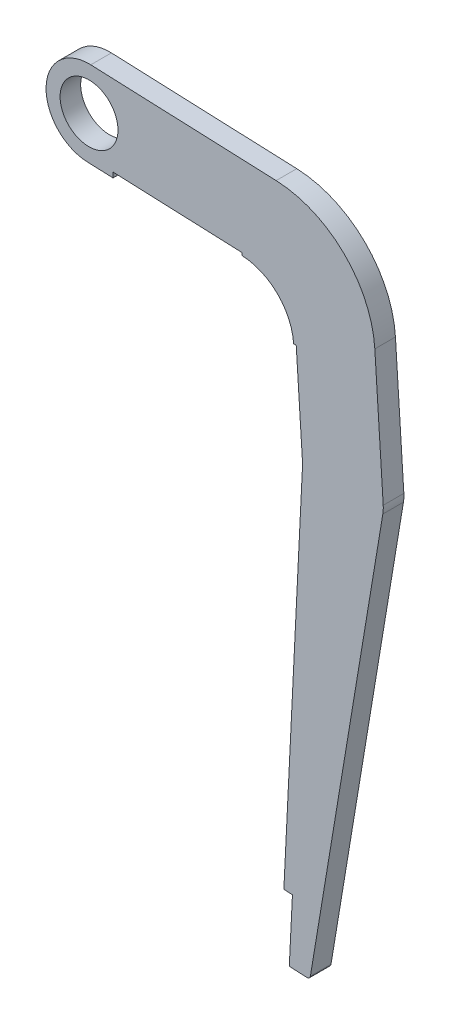
ISO-10303-21;
HEADER;
FILE_DESCRIPTION(('STEP AP214'),'2;1');
FILE_NAME('part.step','',(''),(''),'','','');
FILE_SCHEMA(('AUTOMOTIVE_DESIGN { 1 0 10303 214 1 1 1 1 }'));
ENDSEC;
DATA;
#1=APPLICATION_CONTEXT('core data for automotive mechanical design processes');
#2=APPLICATION_PROTOCOL_DEFINITION('international standard','automotive_design',2000,#1);
#3=PRODUCT_CONTEXT('',#1,'mechanical');
#4=PRODUCT('Part','Part','',(#3));
#5=PRODUCT_RELATED_PRODUCT_CATEGORY('part','',(#4));
#6=PRODUCT_DEFINITION_FORMATION('','',#4);
#7=PRODUCT_DEFINITION_CONTEXT('part definition',#1,'design');
#8=PRODUCT_DEFINITION('design','',#6,#7);
#9=PRODUCT_DEFINITION_SHAPE('','',#8);
#10=(LENGTH_UNIT() NAMED_UNIT(*) SI_UNIT(.MILLI.,.METRE.));
#11=(NAMED_UNIT(*) PLANE_ANGLE_UNIT() SI_UNIT($,.RADIAN.));
#12=(NAMED_UNIT(*) SI_UNIT($,.STERADIAN.) SOLID_ANGLE_UNIT());
#13=UNCERTAINTY_MEASURE_WITH_UNIT(LENGTH_MEASURE(1.E-05),#10,'distance_accuracy_value','');
#14=(GEOMETRIC_REPRESENTATION_CONTEXT(3) GLOBAL_UNCERTAINTY_ASSIGNED_CONTEXT((#13)) GLOBAL_UNIT_ASSIGNED_CONTEXT((#10,
#11,#12)) REPRESENTATION_CONTEXT('',''));
#15=CARTESIAN_POINT('',(0.,0.,0.));
#16=DIRECTION('',(0.,0.,1.));
#17=DIRECTION('',(1.,0.,0.));
#18=AXIS2_PLACEMENT_3D('',#15,#16,#17);
#19=CARTESIAN_POINT('',(-1.02010487388112,-24.9791790506871,0.));
#20=DIRECTION('',(-0.0408041949552447,-0.999167162027483,0.));
#21=DIRECTION('',(0.999167162027483,-0.0408041949552447,0.));
#22=AXIS2_PLACEMENT_3D('',#19,#20,#21);
#23=PLANE('',#22);
#24=DIRECTION('',(0.,0.,-1.));
#25=VECTOR('',#24,1.);
#26=CARTESIAN_POINT('',(13.9552913226989,-25.5907473739468,0.));
#27=LINE('',#26,#25);
#28=CARTESIAN_POINT('',(13.9552913226989,-25.5907473739468,12.));
#29=VERTEX_POINT('',#28);
#30=CARTESIAN_POINT('',(13.9552913226989,-25.5907473739468,0.));
#31=VERTEX_POINT('',#30);
#32=EDGE_CURVE('E11',#29,#31,#27,.T.);
#33=ORIENTED_EDGE('',*,*,#32,.F.);
#34=DIRECTION('',(0.999167162027483,-0.0408041949552447,0.));
#35=VECTOR('',#34,1.);
#36=CARTESIAN_POINT('',(-1.02010487388112,-24.9791790506871,12.));
#37=LINE('',#36,#35);
#38=CARTESIAN_POINT('',(-1.02010487388112,-24.9791790506871,12.));
#39=VERTEX_POINT('',#38);
#40=EDGE_CURVE('E260',#39,#29,#37,.T.);
#41=ORIENTED_EDGE('',*,*,#40,.F.);
#42=DIRECTION('',(0.,0.,-1.));
#43=VECTOR('',#42,1.);
#44=CARTESIAN_POINT('',(-1.02010487388112,-24.9791790506871,0.));
#45=LINE('',#44,#43);
#46=CARTESIAN_POINT('',(-1.02010487388112,-24.9791790506871,0.));
#47=VERTEX_POINT('',#46);
#48=EDGE_CURVE('E57',#39,#47,#45,.T.);
#49=ORIENTED_EDGE('',*,*,#48,.T.);
#50=DIRECTION('',(0.999167162027483,-0.0408041949552447,0.));
#51=VECTOR('',#50,1.);
#52=CARTESIAN_POINT('',(-1.02010487388112,-24.9791790506871,0.));
#53=LINE('',#52,#51);
#54=EDGE_CURVE('E306',#47,#31,#53,.T.);
#55=ORIENTED_EDGE('',*,*,#54,.T.);
#56=EDGE_LOOP('',(#33,#41,#49,#55));
#57=FACE_BOUND('',#56,.T.);
#58=ADVANCED_FACE('F46',(#57),#23,.T.);
#59=CARTESIAN_POINT('',(0.,0.,0.));
#60=DIRECTION('',(0.,0.,1.));
#61=DIRECTION('',(1.,0.,0.));
#62=AXIS2_PLACEMENT_3D('',#59,#60,#61);
#63=CYLINDRICAL_SURFACE('',#62,25.);
#64=ORIENTED_EDGE('',*,*,#48,.F.);
#65=CARTESIAN_POINT('',(0.,0.,12.));
#66=DIRECTION('',(0.,0.,1.));
#67=DIRECTION('',(1.,0.,0.));
#68=AXIS2_PLACEMENT_3D('',#65,#66,#67);
#69=CIRCLE('',#68,25.);
#70=CARTESIAN_POINT('',(1.02010487388112,24.9791790506871,12.));
#71=VERTEX_POINT('',#70);
#72=EDGE_CURVE('E256',#71,#39,#69,.T.);
#73=ORIENTED_EDGE('',*,*,#72,.F.);
#74=DIRECTION('',(0.,0.,-1.));
#75=VECTOR('',#74,1.);
#76=CARTESIAN_POINT('',(1.02010487388112,24.9791790506871,0.));
#77=LINE('',#76,#75);
#78=CARTESIAN_POINT('',(1.02010487388112,24.9791790506871,0.));
#79=VERTEX_POINT('',#78);
#80=EDGE_CURVE('E300',#71,#79,#77,.T.);
#81=ORIENTED_EDGE('',*,*,#80,.T.);
#82=CARTESIAN_POINT('',(0.,0.,0.));
#83=DIRECTION('',(0.,0.,1.));
#84=DIRECTION('',(1.,0.,0.));
#85=AXIS2_PLACEMENT_3D('',#82,#83,#84);
#86=CIRCLE('',#85,25.);
#87=EDGE_CURVE('E313',#79,#47,#86,.T.);
#88=ORIENTED_EDGE('',*,*,#87,.T.);
#89=EDGE_LOOP('',(#64,#73,#81,#88));
#90=FACE_BOUND('',#89,.T.);
#91=ADVANCED_FACE('F318',(#90),#63,.T.);
#92=CARTESIAN_POINT('',(1.02010487388112,24.9791790506871,0.));
#93=DIRECTION('',(0.0408041949552447,0.999167162027483,0.));
#94=DIRECTION('',(-0.999167162027483,0.0408041949552447,0.));
#95=AXIS2_PLACEMENT_3D('',#92,#93,#94);
#96=PLANE('',#95);
#97=ORIENTED_EDGE('',*,*,#80,.F.);
#98=DIRECTION('',(-0.999167162027483,0.0408041949552447,0.));
#99=VECTOR('',#98,1.);
#100=CARTESIAN_POINT('',(1.02010487388112,24.9791790506871,12.));
#101=LINE('',#100,#99);
#102=CARTESIAN_POINT('',(108.926121294905,20.5724908625436,12.));
#103=VERTEX_POINT('',#102);
#104=EDGE_CURVE('E252',#103,#71,#101,.T.);
#105=ORIENTED_EDGE('',*,*,#104,.F.);
#106=DIRECTION('',(0.,0.,-1.));
#107=VECTOR('',#106,1.);
#108=CARTESIAN_POINT('',(108.926121294905,20.5724908625436,0.));
#109=LINE('',#108,#107);
#110=CARTESIAN_POINT('',(108.926121294905,20.5724908625436,0.));
#111=VERTEX_POINT('',#110);
#112=EDGE_CURVE('E297',#103,#111,#109,.T.);
#113=ORIENTED_EDGE('',*,*,#112,.T.);
#114=DIRECTION('',(-0.999167162027483,0.0408041949552447,0.));
#115=VECTOR('',#114,1.);
#116=CARTESIAN_POINT('',(1.02010487388112,24.9791790506871,0.));
#117=LINE('',#116,#115);
#118=EDGE_CURVE('E320',#111,#79,#117,.T.);
#119=ORIENTED_EDGE('',*,*,#118,.T.);
#120=EDGE_LOOP('',(#97,#105,#113,#119));
#121=FACE_BOUND('',#120,.T.);
#122=ADVANCED_FACE('F457',(#121),#96,.T.);
#123=CARTESIAN_POINT('',(106.477869597591,-39.3775388591053,0.));
#124=DIRECTION('',(0.,0.,1.));
#125=DIRECTION('',(1.,0.,0.));
#126=AXIS2_PLACEMENT_3D('',#123,#124,#125);
#127=CYLINDRICAL_SURFACE('',#126,60.);
#128=ORIENTED_EDGE('',*,*,#112,.F.);
#129=CARTESIAN_POINT('',(106.477869597591,-39.3775388591053,12.));
#130=DIRECTION('',(0.,0.,1.));
#131=DIRECTION('',(1.,0.,0.));
#132=AXIS2_PLACEMENT_3D('',#129,#130,#131);
#133=CIRCLE('',#132,60.);
#134=CARTESIAN_POINT('',(166.355398771362,-35.5458942978034,12.));
#135=VERTEX_POINT('',#134);
#136=EDGE_CURVE('E248',#103,#135,#133,.F.);
#137=ORIENTED_EDGE('',*,*,#136,.T.);
#138=DIRECTION('',(0.,0.,-1.));
#139=VECTOR('',#138,1.);
#140=CARTESIAN_POINT('',(166.355398771362,-35.5458942978034,0.));
#141=LINE('',#140,#139);
#142=CARTESIAN_POINT('',(166.355398771362,-35.5458942978034,0.));
#143=VERTEX_POINT('',#142);
#144=EDGE_CURVE('E294',#135,#143,#141,.T.);
#145=ORIENTED_EDGE('',*,*,#144,.T.);
#146=CARTESIAN_POINT('',(106.477869597591,-39.3775388591053,0.));
#147=DIRECTION('',(0.,0.,1.));
#148=DIRECTION('',(1.,0.,0.));
#149=AXIS2_PLACEMENT_3D('',#146,#147,#148);
#150=CIRCLE('',#149,60.);
#151=EDGE_CURVE('E324',#111,#143,#150,.F.);
#152=ORIENTED_EDGE('',*,*,#151,.F.);
#153=EDGE_LOOP('',(#128,#137,#145,#152));
#154=FACE_BOUND('',#153,.T.);
#155=ADVANCED_FACE('F501',(#154),#127,.T.);
#156=CARTESIAN_POINT('',(162.905370512054,18.3680751328224,0.));
#157=DIRECTION('',(0.997958819562857,0.0638607426883654,0.));
#158=DIRECTION('',(-0.0638607426883654,0.997958819562857,0.));
#159=AXIS2_PLACEMENT_3D('',#156,#157,#158);
#160=PLANE('',#159);
#161=ORIENTED_EDGE('',*,*,#144,.F.);
#162=DIRECTION('',(-0.0638607426883654,0.997958819562857,0.));
#163=VECTOR('',#162,1.);
#164=CARTESIAN_POINT('',(162.905370512054,18.3680751328224,12.));
#165=LINE('',#164,#163);
#166=CARTESIAN_POINT('',(171.243379865616,-111.930910154438,12.));
#167=VERTEX_POINT('',#166);
#168=EDGE_CURVE('E244',#167,#135,#165,.T.);
#169=ORIENTED_EDGE('',*,*,#168,.F.);
#170=DIRECTION('',(0.,0.,-1.));
#171=VECTOR('',#170,1.);
#172=CARTESIAN_POINT('',(171.243379865616,-111.930910154438,0.));
#173=LINE('',#172,#171);
#174=CARTESIAN_POINT('',(171.243379865616,-111.930910154438,0.));
#175=VERTEX_POINT('',#174);
#176=EDGE_CURVE('E291',#167,#175,#173,.T.);
#177=ORIENTED_EDGE('',*,*,#176,.T.);
#178=DIRECTION('',(-0.0638607426883654,0.997958819562857,0.));
#179=VECTOR('',#178,1.);
#180=CARTESIAN_POINT('',(162.905370512054,18.3680751328224,0.));
#181=LINE('',#180,#179);
#182=EDGE_CURVE('E331',#175,#143,#181,.T.);
#183=ORIENTED_EDGE('',*,*,#182,.T.);
#184=EDGE_LOOP('',(#161,#169,#177,#183));
#185=FACE_BOUND('',#184,.T.);
#186=ADVANCED_FACE('F497',(#185),#160,.T.);
#187=CARTESIAN_POINT('',(151.284203474359,-113.208125008206,0.));
#188=DIRECTION('',(0.,0.,1.));
#189=DIRECTION('',(1.,0.,0.));
#190=AXIS2_PLACEMENT_3D('',#187,#188,#189);
#191=CYLINDRICAL_SURFACE('',#190,20.);
#192=ORIENTED_EDGE('',*,*,#176,.F.);
#193=CARTESIAN_POINT('',(151.284203474359,-113.208125008206,12.));
#194=DIRECTION('',(0.,0.,1.));
#195=DIRECTION('',(1.,0.,0.));
#196=AXIS2_PLACEMENT_3D('',#193,#194,#195);
#197=CIRCLE('',#196,20.);
#198=CARTESIAN_POINT('',(171.014245871716,-116.483094778827,12.));
#199=VERTEX_POINT('',#198);
#200=EDGE_CURVE('E240',#167,#199,#197,.F.);
#201=ORIENTED_EDGE('',*,*,#200,.T.);
#202=DIRECTION('',(0.,0.,-1.));
#203=VECTOR('',#202,1.);
#204=CARTESIAN_POINT('',(171.014245871716,-116.483094778827,0.));
#205=LINE('',#204,#203);
#206=CARTESIAN_POINT('',(171.014245871716,-116.483094778827,0.));
#207=VERTEX_POINT('',#206);
#208=EDGE_CURVE('E288',#199,#207,#205,.T.);
#209=ORIENTED_EDGE('',*,*,#208,.T.);
#210=CARTESIAN_POINT('',(151.284203474359,-113.208125008206,0.));
#211=DIRECTION('',(0.,0.,1.));
#212=DIRECTION('',(1.,0.,0.));
#213=AXIS2_PLACEMENT_3D('',#210,#211,#212);
#214=CIRCLE('',#213,20.);
#215=EDGE_CURVE('E335',#175,#207,#214,.F.);
#216=ORIENTED_EDGE('',*,*,#215,.F.);
#217=EDGE_LOOP('',(#192,#201,#209,#216));
#218=FACE_BOUND('',#217,.T.);
#219=ADVANCED_FACE('F493',(#218),#191,.T.);
#220=CARTESIAN_POINT('',(171.389870978236,-114.220142814009,0.));
#221=DIRECTION('',(0.986502119867865,-0.163748488531066,0.));
#222=DIRECTION('',(0.163748488531066,0.986502119867865,0.));
#223=AXIS2_PLACEMENT_3D('',#220,#221,#222);
#224=PLANE('',#223);
#225=ORIENTED_EDGE('',*,*,#208,.F.);
#226=DIRECTION('',(0.163748488531066,0.986502119867865,0.));
#227=VECTOR('',#226,1.);
#228=CARTESIAN_POINT('',(171.389870978236,-114.220142814009,12.));
#229=LINE('',#228,#227);
#230=CARTESIAN_POINT('',(128.850807395398,-370.496562694989,12.));
#231=VERTEX_POINT('',#230);
#232=EDGE_CURVE('E236',#231,#199,#229,.T.);
#233=ORIENTED_EDGE('',*,*,#232,.F.);
#234=DIRECTION('',(0.,0.,-1.));
#235=VECTOR('',#234,1.);
#236=CARTESIAN_POINT('',(128.850807395398,-370.496562694989,0.));
#237=LINE('',#236,#235);
#238=CARTESIAN_POINT('',(128.850807395398,-370.496562694989,0.));
#239=VERTEX_POINT('',#238);
#240=EDGE_CURVE('E285',#231,#239,#237,.T.);
#241=ORIENTED_EDGE('',*,*,#240,.T.);
#242=DIRECTION('',(0.163748488531066,0.986502119867865,0.));
#243=VECTOR('',#242,1.);
#244=CARTESIAN_POINT('',(171.389870978236,-114.220142814009,0.));
#245=LINE('',#244,#243);
#246=EDGE_CURVE('E339',#239,#207,#245,.T.);
#247=ORIENTED_EDGE('',*,*,#246,.T.);
#248=EDGE_LOOP('',(#225,#233,#241,#247));
#249=FACE_BOUND('',#248,.T.);
#250=ADVANCED_FACE('F489',(#249),#224,.T.);
#251=CARTESIAN_POINT('',(126.877803155662,-370.169065717927,0.));
#252=DIRECTION('',(0.,0.,1.));
#253=DIRECTION('',(1.,0.,0.));
#254=AXIS2_PLACEMENT_3D('',#251,#252,#253);
#255=CYLINDRICAL_SURFACE('',#254,2.);
#256=ORIENTED_EDGE('',*,*,#240,.F.);
#257=CARTESIAN_POINT('',(126.877803155662,-370.169065717927,12.));
#258=DIRECTION('',(0.,0.,1.));
#259=DIRECTION('',(1.,0.,0.));
#260=AXIS2_PLACEMENT_3D('',#257,#258,#259);
#261=CIRCLE('',#260,2.);
#262=CARTESIAN_POINT('',(126.778759337733,-372.166611793023,12.));
#263=VERTEX_POINT('',#262);
#264=EDGE_CURVE('E232',#231,#263,#261,.F.);
#265=ORIENTED_EDGE('',*,*,#264,.T.);
#266=DIRECTION('',(0.,0.,-1.));
#267=VECTOR('',#266,1.);
#268=CARTESIAN_POINT('',(126.778759337733,-372.166611793023,0.));
#269=LINE('',#268,#267);
#270=CARTESIAN_POINT('',(126.778759337733,-372.166611793023,0.));
#271=VERTEX_POINT('',#270);
#272=EDGE_CURVE('E282',#263,#271,#269,.T.);
#273=ORIENTED_EDGE('',*,*,#272,.T.);
#274=CARTESIAN_POINT('',(126.877803155662,-370.169065717927,0.));
#275=DIRECTION('',(0.,0.,1.));
#276=DIRECTION('',(1.,0.,0.));
#277=AXIS2_PLACEMENT_3D('',#274,#275,#276);
#278=CIRCLE('',#277,2.);
#279=EDGE_CURVE('E343',#239,#271,#278,.F.);
#280=ORIENTED_EDGE('',*,*,#279,.F.);
#281=EDGE_LOOP('',(#256,#265,#273,#280));
#282=FACE_BOUND('',#281,.T.);
#283=ADVANCED_FACE('F485',(#282),#255,.T.);
#284=CARTESIAN_POINT('',(128.558946358854,-372.254878352377,0.));
#285=DIRECTION('',(-0.0495219089647808,-0.998773037547813,0.));
#286=DIRECTION('',(0.998773037547812,-0.0495219089647808,0.));
#287=AXIS2_PLACEMENT_3D('',#284,#285,#286);
#288=PLANE('',#287);
#289=ORIENTED_EDGE('',*,*,#272,.F.);
#290=DIRECTION('',(0.998773037547812,-0.0495219089647808,0.));
#291=VECTOR('',#290,1.);
#292=CARTESIAN_POINT('',(128.558946358854,-372.254878352377,12.));
#293=LINE('',#292,#291);
#294=CARTESIAN_POINT('',(116.57366990828,-371.6606154448,12.));
#295=VERTEX_POINT('',#294);
#296=EDGE_CURVE('E228',#295,#263,#293,.T.);
#297=ORIENTED_EDGE('',*,*,#296,.F.);
#298=DIRECTION('',(0.,0.,-1.));
#299=VECTOR('',#298,1.);
#300=CARTESIAN_POINT('',(116.57366990828,-371.6606154448,0.));
#301=LINE('',#300,#299);
#302=CARTESIAN_POINT('',(116.57366990828,-371.6606154448,0.));
#303=VERTEX_POINT('',#302);
#304=EDGE_CURVE('E279',#295,#303,#301,.T.);
#305=ORIENTED_EDGE('',*,*,#304,.T.);
#306=DIRECTION('',(0.998773037547812,-0.0495219089647808,0.));
#307=VECTOR('',#306,1.);
#308=CARTESIAN_POINT('',(128.558946358854,-372.254878352377,0.));
#309=LINE('',#308,#307);
#310=EDGE_CURVE('E347',#303,#271,#309,.T.);
#311=ORIENTED_EDGE('',*,*,#310,.T.);
#312=EDGE_LOOP('',(#289,#297,#305,#311));
#313=FACE_BOUND('',#312,.T.);
#314=ADVANCED_FACE('F482',(#313),#288,.T.);
#315=CARTESIAN_POINT('',(134.670542869666,-6.67733520380468,0.));
#316=DIRECTION('',(0.998773037547813,-0.0495219089647786,0.));
#317=DIRECTION('',(0.0495219089647786,0.998773037547813,0.));
#318=AXIS2_PLACEMENT_3D('',#315,#316,#317);
#319=PLANE('',#318);
#320=ORIENTED_EDGE('',*,*,#304,.F.);
#321=DIRECTION('',(0.0495219089647786,0.998773037547813,0.));
#322=VECTOR('',#321,1.);
#323=CARTESIAN_POINT('',(134.670542869666,-6.67733520380468,12.));
#324=LINE('',#323,#322);
#325=CARTESIAN_POINT('',(118.405980539977,-334.70601305553,12.));
#326=VERTEX_POINT('',#325);
#327=EDGE_CURVE('E224',#295,#326,#324,.T.);
#328=ORIENTED_EDGE('',*,*,#327,.T.);
#329=DIRECTION('',(0.,0.,-1.));
#330=VECTOR('',#329,1.);
#331=CARTESIAN_POINT('',(118.405980539977,-334.70601305553,0.));
#332=LINE('',#331,#330);
#333=CARTESIAN_POINT('',(118.405980539977,-334.70601305553,0.));
#334=VERTEX_POINT('',#333);
#335=EDGE_CURVE('E276',#326,#334,#332,.T.);
#336=ORIENTED_EDGE('',*,*,#335,.T.);
#337=DIRECTION('',(0.0495219089647786,0.998773037547813,0.));
#338=VECTOR('',#337,1.);
#339=CARTESIAN_POINT('',(134.670542869666,-6.67733520380468,0.));
#340=LINE('',#339,#338);
#341=EDGE_CURVE('E351',#303,#334,#340,.T.);
#342=ORIENTED_EDGE('',*,*,#341,.F.);
#343=EDGE_LOOP('',(#320,#328,#336,#342));
#344=FACE_BOUND('',#343,.T.);
#345=ADVANCED_FACE('F479',(#344),#319,.F.);
#346=CARTESIAN_POINT('',(-16.2645623296886,-328.028677851726,0.));
#347=DIRECTION('',(0.0495219089647753,0.998773037547813,0.));
#348=DIRECTION('',(-0.998773037547813,0.0495219089647753,0.));
#349=AXIS2_PLACEMENT_3D('',#346,#347,#348);
#350=PLANE('',#349);
#351=ORIENTED_EDGE('',*,*,#335,.F.);
#352=DIRECTION('',(-0.998773037547813,0.0495219089647753,0.));
#353=VECTOR('',#352,1.);
#354=CARTESIAN_POINT('',(-16.2645623296886,-328.028677851726,12.));
#355=LINE('',#354,#353);
#356=CARTESIAN_POINT('',(113.412115352239,-334.458403510707,12.));
#357=VERTEX_POINT('',#356);
#358=EDGE_CURVE('E220',#326,#357,#355,.T.);
#359=ORIENTED_EDGE('',*,*,#358,.T.);
#360=DIRECTION('',(0.,0.,-1.));
#361=VECTOR('',#360,1.);
#362=CARTESIAN_POINT('',(113.412115352239,-334.458403510707,0.));
#363=LINE('',#362,#361);
#364=CARTESIAN_POINT('',(113.412115352239,-334.458403510707,0.));
#365=VERTEX_POINT('',#364);
#366=EDGE_CURVE('E185',#357,#365,#363,.T.);
#367=ORIENTED_EDGE('',*,*,#366,.T.);
#368=DIRECTION('',(-0.998773037547813,0.0495219089647753,0.));
#369=VECTOR('',#368,1.);
#370=CARTESIAN_POINT('',(-16.2645623296886,-328.028677851726,0.));
#371=LINE('',#370,#369);
#372=EDGE_CURVE('E194',#334,#365,#371,.T.);
#373=ORIENTED_EDGE('',*,*,#372,.F.);
#374=EDGE_LOOP('',(#351,#359,#367,#373));
#375=FACE_BOUND('',#374,.T.);
#376=ADVANCED_FACE('F368',(#375),#350,.F.);
#377=CARTESIAN_POINT('',(124.315371497829,-114.558191920736,0.));
#378=DIRECTION('',(0.998773037547813,-0.0495219089647782,0.));
#379=DIRECTION('',(0.0495219089647782,0.998773037547813,0.));
#380=AXIS2_PLACEMENT_3D('',#377,#378,#379);
#381=PLANE('',#380);
#382=ORIENTED_EDGE('',*,*,#366,.F.);
#383=DIRECTION('',(0.0495219089647782,0.998773037547813,0.));
#384=VECTOR('',#383,1.);
#385=CARTESIAN_POINT('',(124.315371497829,-114.558191920736,12.));
#386=LINE('',#385,#384);
#387=CARTESIAN_POINT('',(124.315371497829,-114.558191920736,12.));
#388=VERTEX_POINT('',#387);
#389=EDGE_CURVE('E180',#357,#388,#386,.T.);
#390=ORIENTED_EDGE('',*,*,#389,.T.);
#391=DIRECTION('',(0.,0.,-1.));
#392=VECTOR('',#391,1.);
#393=CARTESIAN_POINT('',(124.315371497829,-114.558191920736,0.));
#394=LINE('',#393,#392);
#395=CARTESIAN_POINT('',(124.315371497829,-114.558191920736,0.));
#396=VERTEX_POINT('',#395);
#397=EDGE_CURVE('E175',#388,#396,#394,.T.);
#398=ORIENTED_EDGE('',*,*,#397,.T.);
#399=DIRECTION('',(0.0495219089647782,0.998773037547813,0.));
#400=VECTOR('',#399,1.);
#401=CARTESIAN_POINT('',(124.315371497829,-114.558191920736,0.));
#402=LINE('',#401,#400);
#403=EDGE_CURVE('E178',#365,#396,#402,.T.);
#404=ORIENTED_EDGE('',*,*,#403,.F.);
#405=EDGE_LOOP('',(#382,#390,#398,#404));
#406=FACE_BOUND('',#405,.T.);
#407=ADVANCED_FACE('F177',(#406),#381,.F.);
#408=CARTESIAN_POINT('',(120.601343671677,-56.5186723476985,0.));
#409=DIRECTION('',(0.997958819562857,0.0638607426883653,0.));
#410=DIRECTION('',(-0.0638607426883653,0.997958819562857,0.));
#411=AXIS2_PLACEMENT_3D('',#408,#409,#410);
#412=PLANE('',#411);
#413=ORIENTED_EDGE('',*,*,#397,.F.);
#414=DIRECTION('',(-0.0638607426883653,0.997958819562857,0.));
#415=VECTOR('',#414,1.);
#416=CARTESIAN_POINT('',(120.601343671677,-56.5186723476985,12.));
#417=LINE('',#416,#415);
#418=CARTESIAN_POINT('',(120.601343671677,-56.5186723476985,12.));
#419=VERTEX_POINT('',#418);
#420=EDGE_CURVE('E214',#388,#419,#417,.T.);
#421=ORIENTED_EDGE('',*,*,#420,.T.);
#422=DIRECTION('',(0.,0.,-1.));
#423=VECTOR('',#422,1.);
#424=CARTESIAN_POINT('',(120.601343671677,-56.5186723476985,0.));
#425=LINE('',#424,#423);
#426=CARTESIAN_POINT('',(120.601343671677,-56.5186723476985,0.));
#427=VERTEX_POINT('',#426);
#428=EDGE_CURVE('E186',#419,#427,#425,.T.);
#429=ORIENTED_EDGE('',*,*,#428,.T.);
#430=DIRECTION('',(-0.0638607426883653,0.997958819562857,0.));
#431=VECTOR('',#430,1.);
#432=CARTESIAN_POINT('',(120.601343671677,-56.5186723476985,0.));
#433=LINE('',#432,#431);
#434=EDGE_CURVE('E191',#396,#427,#433,.T.);
#435=ORIENTED_EDGE('',*,*,#434,.F.);
#436=EDGE_LOOP('',(#413,#421,#429,#435));
#437=FACE_BOUND('',#436,.T.);
#438=ADVANCED_FACE('F197',(#437),#412,.F.);
#439=CARTESIAN_POINT('',(13.9552913226989,-22.5882467774375,0.));
#440=DIRECTION('',(0.0408041949552447,0.999167162027483,0.));
#441=DIRECTION('',(-0.999167162027483,0.0408041949552447,0.));
#442=AXIS2_PLACEMENT_3D('',#439,#440,#441);
#443=PLANE('',#442);
#444=DIRECTION('',(0.,0.,-1.));
#445=VECTOR('',#444,1.);
#446=CARTESIAN_POINT('',(89.0152410596258,-25.6535605095077,0.));
#447=LINE('',#446,#445);
#448=CARTESIAN_POINT('',(89.0152410596258,-25.6535605095077,12.));
#449=VERTEX_POINT('',#448);
#450=CARTESIAN_POINT('',(89.0152410596258,-25.6535605095077,0.));
#451=VERTEX_POINT('',#450);
#452=EDGE_CURVE('E268',#449,#451,#447,.T.);
#453=ORIENTED_EDGE('',*,*,#452,.F.);
#454=DIRECTION('',(-0.999167162027483,0.0408041949552447,0.));
#455=VECTOR('',#454,1.);
#456=CARTESIAN_POINT('',(13.9552913226989,-22.5882467774375,12.));
#457=LINE('',#456,#455);
#458=CARTESIAN_POINT('',(13.9552913226989,-22.5882467774375,12.));
#459=VERTEX_POINT('',#458);
#460=EDGE_CURVE('E208',#449,#459,#457,.T.);
#461=ORIENTED_EDGE('',*,*,#460,.T.);
#462=DIRECTION('',(0.,0.,-1.));
#463=VECTOR('',#462,1.);
#464=CARTESIAN_POINT('',(13.9552913226989,-22.5882467774375,0.));
#465=LINE('',#464,#463);
#466=CARTESIAN_POINT('',(13.9552913226989,-22.5882467774375,0.));
#467=VERTEX_POINT('',#466);
#468=EDGE_CURVE('E50',#459,#467,#465,.T.);
#469=ORIENTED_EDGE('',*,*,#468,.T.);
#470=DIRECTION('',(-0.999167162027483,0.0408041949552447,0.));
#471=VECTOR('',#470,1.);
#472=CARTESIAN_POINT('',(13.9552913226989,-22.5882467774375,0.));
#473=LINE('',#472,#471);
#474=EDGE_CURVE('E65',#451,#467,#473,.T.);
#475=ORIENTED_EDGE('',*,*,#474,.F.);
#476=EDGE_LOOP('',(#453,#461,#469,#475));
#477=FACE_BOUND('',#476,.T.);
#478=ADVANCED_FACE('F433',(#477),#443,.F.);
#479=CARTESIAN_POINT('',(13.9552913226989,-22.5882467774375,0.));
#480=DIRECTION('',(-1.,0.,0.));
#481=DIRECTION('',(0.,-1.,0.));
#482=AXIS2_PLACEMENT_3D('',#479,#480,#481);
#483=PLANE('',#482);
#484=DIRECTION('',(0.,1.,0.));
#485=VECTOR('',#484,1.);
#486=CARTESIAN_POINT('',(13.9552913226989,0.,12.));
#487=LINE('',#486,#485);
#488=EDGE_CURVE('E212',#459,#29,#487,.F.);
#489=ORIENTED_EDGE('',*,*,#488,.T.);
#490=ORIENTED_EDGE('',*,*,#32,.T.);
#491=DIRECTION('',(0.,-1.,0.));
#492=VECTOR('',#491,1.);
#493=CARTESIAN_POINT('',(13.9552913226989,-22.5882467774375,0.));
#494=LINE('',#493,#492);
#495=EDGE_CURVE('E315',#467,#31,#494,.T.);
#496=ORIENTED_EDGE('',*,*,#495,.F.);
#497=ORIENTED_EDGE('',*,*,#468,.F.);
#498=EDGE_LOOP('',(#489,#490,#496,#497));
#499=FACE_BOUND('',#498,.T.);
#500=ADVANCED_FACE('F431',(#499),#483,.F.);
#501=CARTESIAN_POINT('',(0.,0.,0.));
#502=DIRECTION('',(0.,0.,1.));
#503=DIRECTION('',(1.,0.,0.));
#504=AXIS2_PLACEMENT_3D('',#501,#502,#503);
#505=CYLINDRICAL_SURFACE('',#504,16.85);
#506=CARTESIAN_POINT('',(0.,0.,0.));
#507=DIRECTION('',(0.,0.,1.));
#508=DIRECTION('',(1.,0.,0.));
#509=AXIS2_PLACEMENT_3D('',#506,#507,#508);
#510=CIRCLE('',#509,16.85);
#511=CARTESIAN_POINT('',(16.85,0.,0.));
#512=VERTEX_POINT('',#511);
#513=EDGE_CURVE('E200',#512,#512,#510,.T.);
#514=ORIENTED_EDGE('',*,*,#513,.F.);
#515=EDGE_LOOP('',(#514));
#516=FACE_BOUND('',#515,.T.);
#517=CARTESIAN_POINT('',(0.,0.,12.));
#518=DIRECTION('',(0.,0.,1.));
#519=DIRECTION('',(1.,0.,0.));
#520=AXIS2_PLACEMENT_3D('',#517,#518,#519);
#521=CIRCLE('',#520,16.85);
#522=CARTESIAN_POINT('',(16.85,0.,12.));
#523=VERTEX_POINT('',#522);
#524=EDGE_CURVE('E217',#523,#523,#521,.T.);
#525=ORIENTED_EDGE('',*,*,#524,.T.);
#526=EDGE_LOOP('',(#525));
#527=FACE_BOUND('',#526,.T.);
#528=ADVANCED_FACE('F48',(#516,#527),#505,.F.);
#529=CARTESIAN_POINT('',(0.,0.,0.));
#530=DIRECTION('',(0.,0.,1.));
#531=DIRECTION('',(1.,0.,0.));
#532=AXIS2_PLACEMENT_3D('',#529,#530,#531);
#533=PLANE('',#532);
#534=ORIENTED_EDGE('',*,*,#474,.T.);
#535=ORIENTED_EDGE('',*,*,#495,.T.);
#536=ORIENTED_EDGE('',*,*,#54,.F.);
#537=ORIENTED_EDGE('',*,*,#87,.F.);
#538=ORIENTED_EDGE('',*,*,#118,.F.);
#539=ORIENTED_EDGE('',*,*,#151,.T.);
#540=ORIENTED_EDGE('',*,*,#182,.F.);
#541=ORIENTED_EDGE('',*,*,#215,.T.);
#542=ORIENTED_EDGE('',*,*,#246,.F.);
#543=ORIENTED_EDGE('',*,*,#279,.T.);
#544=ORIENTED_EDGE('',*,*,#310,.F.);
#545=ORIENTED_EDGE('',*,*,#341,.T.);
#546=ORIENTED_EDGE('',*,*,#372,.T.);
#547=ORIENTED_EDGE('',*,*,#403,.T.);
#548=ORIENTED_EDGE('',*,*,#434,.T.);
#549=DIRECTION('',(-0.997958819562857,-0.0638607426883681,0.));
#550=VECTOR('',#549,1.);
#551=CARTESIAN_POINT('',(120.601343671677,-56.5186723476985,0.));
#552=LINE('',#551,#550);
#553=CARTESIAN_POINT('',(119.104405442333,-56.6144634617311,0.));
#554=VERTEX_POINT('',#553);
#555=EDGE_CURVE('E130',#427,#554,#552,.T.);
#556=ORIENTED_EDGE('',*,*,#555,.T.);
#557=CARTESIAN_POINT('',(87.6687026261028,-58.6260768564146,0.));
#558=DIRECTION('',(0.,0.,1.));
#559=DIRECTION('',(1.,0.,0.));
#560=AXIS2_PLACEMENT_3D('',#557,#558,#559);
#561=CIRCLE('',#560,31.5);
#562=CARTESIAN_POINT('',(88.9540347671929,-27.1523112525489,0.));
#563=VERTEX_POINT('',#562);
#564=EDGE_CURVE('E385',#554,#563,#561,.T.);
#565=ORIENTED_EDGE('',*,*,#564,.T.);
#566=DIRECTION('',(0.0408041949552425,0.999167162027483,0.));
#567=VECTOR('',#566,1.);
#568=CARTESIAN_POINT('',(89.0152410596258,-25.6535605095077,0.));
#569=LINE('',#568,#567);
#570=EDGE_CURVE('E213',#563,#451,#569,.T.);
#571=ORIENTED_EDGE('',*,*,#570,.T.);
#572=EDGE_LOOP('',(#534,#535,#536,#537,#538,#539,#540,#541,#542,#543,#544,#545,#546,#547,#548,
#556,#565,#571));
#573=FACE_BOUND('',#572,.T.);
#574=ORIENTED_EDGE('',*,*,#513,.T.);
#575=EDGE_LOOP('',(#574));
#576=FACE_BOUND('',#575,.T.);
#577=ADVANCED_FACE('F189',(#573,#576),#533,.F.);
#578=CARTESIAN_POINT('',(0.,0.,12.));
#579=DIRECTION('',(0.,0.,1.));
#580=DIRECTION('',(1.,0.,0.));
#581=AXIS2_PLACEMENT_3D('',#578,#579,#580);
#582=PLANE('',#581);
#583=ORIENTED_EDGE('',*,*,#460,.F.);
#584=DIRECTION('',(-0.0408041949552425,-0.999167162027483,0.));
#585=VECTOR('',#584,1.);
#586=CARTESIAN_POINT('',(89.0152410596258,-25.6535605095077,12.));
#587=LINE('',#586,#585);
#588=CARTESIAN_POINT('',(88.9540347671929,-27.1523112525489,12.));
#589=VERTEX_POINT('',#588);
#590=EDGE_CURVE('E393',#449,#589,#587,.T.);
#591=ORIENTED_EDGE('',*,*,#590,.T.);
#592=CARTESIAN_POINT('',(87.6687026261028,-58.6260768564146,12.));
#593=DIRECTION('',(0.,0.,-1.));
#594=DIRECTION('',(1.,0.,0.));
#595=AXIS2_PLACEMENT_3D('',#592,#593,#594);
#596=CIRCLE('',#595,31.5);
#597=CARTESIAN_POINT('',(119.104405442333,-56.6144634617311,12.));
#598=VERTEX_POINT('',#597);
#599=EDGE_CURVE('E397',#589,#598,#596,.T.);
#600=ORIENTED_EDGE('',*,*,#599,.T.);
#601=DIRECTION('',(0.997958819562857,0.0638607426883681,0.));
#602=VECTOR('',#601,1.);
#603=CARTESIAN_POINT('',(120.601343671677,-56.5186723476985,12.));
#604=LINE('',#603,#602);
#605=EDGE_CURVE('E378',#598,#419,#604,.T.);
#606=ORIENTED_EDGE('',*,*,#605,.T.);
#607=ORIENTED_EDGE('',*,*,#420,.F.);
#608=ORIENTED_EDGE('',*,*,#389,.F.);
#609=ORIENTED_EDGE('',*,*,#358,.F.);
#610=ORIENTED_EDGE('',*,*,#327,.F.);
#611=ORIENTED_EDGE('',*,*,#296,.T.);
#612=ORIENTED_EDGE('',*,*,#264,.F.);
#613=ORIENTED_EDGE('',*,*,#232,.T.);
#614=ORIENTED_EDGE('',*,*,#200,.F.);
#615=ORIENTED_EDGE('',*,*,#168,.T.);
#616=ORIENTED_EDGE('',*,*,#136,.F.);
#617=ORIENTED_EDGE('',*,*,#104,.T.);
#618=ORIENTED_EDGE('',*,*,#72,.T.);
#619=ORIENTED_EDGE('',*,*,#40,.T.);
#620=ORIENTED_EDGE('',*,*,#488,.F.);
#621=EDGE_LOOP('',(#583,#591,#600,#606,#607,#608,#609,#610,#611,#612,#613,#614,#615,#616,#617,
#618,#619,#620));
#622=FACE_BOUND('',#621,.T.);
#623=ORIENTED_EDGE('',*,*,#524,.F.);
#624=EDGE_LOOP('',(#623));
#625=FACE_BOUND('',#624,.T.);
#626=ADVANCED_FACE('F372',(#622,#625),#582,.T.);
#627=CARTESIAN_POINT('',(120.601343671677,-56.5186723476985,-44.2733517198872));
#628=DIRECTION('',(0.0638607426883681,-0.997958819562857,0.));
#629=DIRECTION('',(0.997958819562857,0.0638607426883681,0.));
#630=AXIS2_PLACEMENT_3D('',#627,#628,#629);
#631=PLANE('',#630);
#632=ORIENTED_EDGE('',*,*,#555,.F.);
#633=ORIENTED_EDGE('',*,*,#428,.F.);
#634=ORIENTED_EDGE('',*,*,#605,.F.);
#635=DIRECTION('',(0.,0.,1.));
#636=VECTOR('',#635,1.);
#637=CARTESIAN_POINT('',(119.104405442333,-56.6144634617311,-44.2733517198872));
#638=LINE('',#637,#636);
#639=EDGE_CURVE('E383',#554,#598,#638,.T.);
#640=ORIENTED_EDGE('',*,*,#639,.F.);
#641=EDGE_LOOP('',(#632,#633,#634,#640));
#642=FACE_BOUND('',#641,.T.);
#643=ADVANCED_FACE('F380',(#642),#631,.T.);
#644=CARTESIAN_POINT('',(87.6687026261028,-58.6260768564146,-44.2733517198872));
#645=DIRECTION('',(0.,0.,1.));
#646=DIRECTION('',(1.,0.,0.));
#647=AXIS2_PLACEMENT_3D('',#644,#645,#646);
#648=CYLINDRICAL_SURFACE('',#647,31.5);
#649=ORIENTED_EDGE('',*,*,#564,.F.);
#650=ORIENTED_EDGE('',*,*,#639,.T.);
#651=ORIENTED_EDGE('',*,*,#599,.F.);
#652=DIRECTION('',(0.,0.,1.));
#653=VECTOR('',#652,1.);
#654=CARTESIAN_POINT('',(88.9540347671929,-27.1523112525489,-44.2733517198872));
#655=LINE('',#654,#653);
#656=EDGE_CURVE('E402',#563,#589,#655,.T.);
#657=ORIENTED_EDGE('',*,*,#656,.F.);
#658=EDGE_LOOP('',(#649,#650,#651,#657));
#659=FACE_BOUND('',#658,.T.);
#660=ADVANCED_FACE('F443',(#659),#648,.F.);
#661=CARTESIAN_POINT('',(89.0152410596258,-25.6535605095077,-44.2733517198872));
#662=DIRECTION('',(-0.999167162027483,0.0408041949552425,0.));
#663=DIRECTION('',(-0.0408041949552425,-0.999167162027483,0.));
#664=AXIS2_PLACEMENT_3D('',#661,#662,#663);
#665=PLANE('',#664);
#666=ORIENTED_EDGE('',*,*,#570,.F.);
#667=ORIENTED_EDGE('',*,*,#656,.T.);
#668=ORIENTED_EDGE('',*,*,#590,.F.);
#669=ORIENTED_EDGE('',*,*,#452,.T.);
#670=EDGE_LOOP('',(#666,#667,#668,#669));
#671=FACE_BOUND('',#670,.T.);
#672=ADVANCED_FACE('F438',(#671),#665,.T.);
#673=CLOSED_SHELL('',(#58,#91,#122,#155,#186,#219,#250,#283,#314,#345,#376,#407,#438,#478,#500,
#528,#577,#626,#643,#660,#672));
#674=MANIFOLD_SOLID_BREP('B2',#673);
#675=ADVANCED_BREP_SHAPE_REPRESENTATION('',(#18,#674),#14);
#676=SHAPE_DEFINITION_REPRESENTATION(#9,#675);
ENDSEC;
END-ISO-10303-21;
